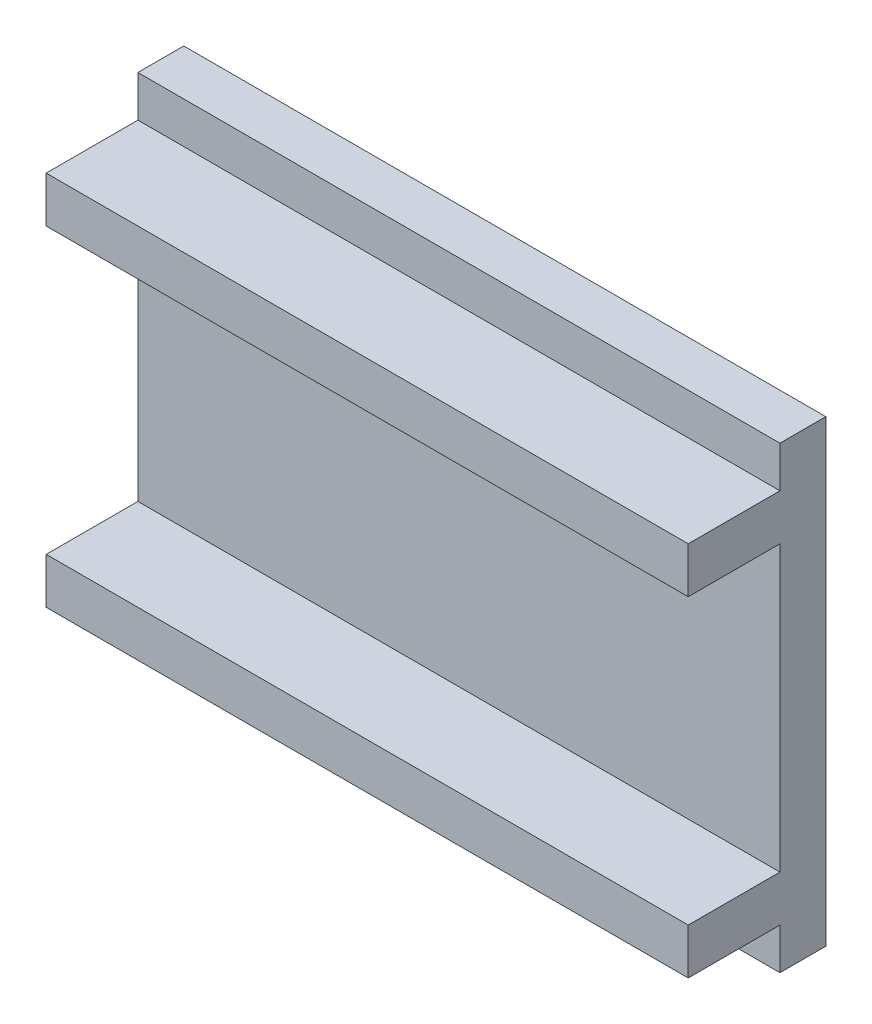
ISO-10303-21;
HEADER;
FILE_DESCRIPTION(('STEP AP214'),'2;1');
FILE_NAME('part.step','',(''),(''),'','','');
FILE_SCHEMA(('AUTOMOTIVE_DESIGN { 1 0 10303 214 1 1 1 1 }'));
ENDSEC;
DATA;
#1=APPLICATION_CONTEXT('core data for automotive mechanical design processes');
#2=APPLICATION_PROTOCOL_DEFINITION('international standard','automotive_design',2000,#1);
#3=PRODUCT_CONTEXT('',#1,'mechanical');
#4=PRODUCT('Part','Part','',(#3));
#5=PRODUCT_RELATED_PRODUCT_CATEGORY('part','',(#4));
#6=PRODUCT_DEFINITION_FORMATION('','',#4);
#7=PRODUCT_DEFINITION_CONTEXT('part definition',#1,'design');
#8=PRODUCT_DEFINITION('design','',#6,#7);
#9=PRODUCT_DEFINITION_SHAPE('','',#8);
#10=(LENGTH_UNIT() NAMED_UNIT(*) SI_UNIT(.MILLI.,.METRE.));
#11=(NAMED_UNIT(*) PLANE_ANGLE_UNIT() SI_UNIT($,.RADIAN.));
#12=(NAMED_UNIT(*) SI_UNIT($,.STERADIAN.) SOLID_ANGLE_UNIT());
#13=UNCERTAINTY_MEASURE_WITH_UNIT(LENGTH_MEASURE(1.E-05),#10,'distance_accuracy_value','');
#14=(GEOMETRIC_REPRESENTATION_CONTEXT(3) GLOBAL_UNCERTAINTY_ASSIGNED_CONTEXT((#13)) GLOBAL_UNIT_ASSIGNED_CONTEXT((#10,
#11,#12)) REPRESENTATION_CONTEXT('',''));
#15=CARTESIAN_POINT('',(0.,0.,0.));
#16=DIRECTION('',(0.,0.,1.));
#17=DIRECTION('',(1.,0.,0.));
#18=AXIS2_PLACEMENT_3D('',#15,#16,#17);
#19=CARTESIAN_POINT('',(0.,0.,5.));
#20=DIRECTION('',(0.,0.,-1.));
#21=DIRECTION('',(-1.,0.,0.));
#22=AXIS2_PLACEMENT_3D('',#19,#20,#21);
#23=PLANE('',#22);
#24=DIRECTION('',(0.,1.,0.));
#25=VECTOR('',#24,1.);
#26=CARTESIAN_POINT('',(35.,-25.,5.));
#27=LINE('',#26,#25);
#28=CARTESIAN_POINT('',(35.,-25.,5.));
#29=VERTEX_POINT('',#28);
#30=CARTESIAN_POINT('',(35.,-20.5,5.));
#31=VERTEX_POINT('',#30);
#32=EDGE_CURVE('E69',#29,#31,#27,.T.);
#33=ORIENTED_EDGE('',*,*,#32,.T.);
#34=DIRECTION('',(-1.,0.,0.));
#35=VECTOR('',#34,1.);
#36=CARTESIAN_POINT('',(-35.,-20.5,5.));
#37=LINE('',#36,#35);
#38=CARTESIAN_POINT('',(-35.,-20.5,5.));
#39=VERTEX_POINT('',#38);
#40=EDGE_CURVE('E171',#31,#39,#37,.T.);
#41=ORIENTED_EDGE('',*,*,#40,.T.);
#42=DIRECTION('',(0.,-1.,0.));
#43=VECTOR('',#42,1.);
#44=CARTESIAN_POINT('',(-35.,-25.,5.));
#45=LINE('',#44,#43);
#46=CARTESIAN_POINT('',(-35.,-25.,5.));
#47=VERTEX_POINT('',#46);
#48=EDGE_CURVE('E143',#39,#47,#45,.T.);
#49=ORIENTED_EDGE('',*,*,#48,.T.);
#50=DIRECTION('',(1.,0.,0.));
#51=VECTOR('',#50,1.);
#52=CARTESIAN_POINT('',(-35.,-25.,5.));
#53=LINE('',#52,#51);
#54=EDGE_CURVE('E231',#47,#29,#53,.T.);
#55=ORIENTED_EDGE('',*,*,#54,.T.);
#56=EDGE_LOOP('',(#33,#41,#49,#55));
#57=FACE_BOUND('',#56,.T.);
#58=ADVANCED_FACE('F45',(#57),#23,.F.);
#59=DIRECTION('',(-1.,0.,0.));
#60=VECTOR('',#59,1.);
#61=CARTESIAN_POINT('',(-35.,20.5,5.));
#62=LINE('',#61,#60);
#63=CARTESIAN_POINT('',(35.,20.5,5.));
#64=VERTEX_POINT('',#63);
#65=CARTESIAN_POINT('',(-35.,20.5,5.));
#66=VERTEX_POINT('',#65);
#67=EDGE_CURVE('E189',#64,#66,#62,.T.);
#68=ORIENTED_EDGE('',*,*,#67,.F.);
#69=CARTESIAN_POINT('',(35.,25.,5.));
#70=VERTEX_POINT('',#69);
#71=EDGE_CURVE('E225',#64,#70,#27,.T.);
#72=ORIENTED_EDGE('',*,*,#71,.T.);
#73=DIRECTION('',(-1.,0.,0.));
#74=VECTOR('',#73,1.);
#75=CARTESIAN_POINT('',(-35.,25.,5.));
#76=LINE('',#75,#74);
#77=CARTESIAN_POINT('',(-35.,25.,5.));
#78=VERTEX_POINT('',#77);
#79=EDGE_CURVE('E223',#70,#78,#76,.T.);
#80=ORIENTED_EDGE('',*,*,#79,.T.);
#81=EDGE_CURVE('E228',#78,#66,#45,.T.);
#82=ORIENTED_EDGE('',*,*,#81,.T.);
#83=EDGE_LOOP('',(#68,#72,#80,#82));
#84=FACE_BOUND('',#83,.T.);
#85=ADVANCED_FACE('F284',(#84),#23,.F.);
#86=CARTESIAN_POINT('',(-35.,15.5,5.));
#87=VERTEX_POINT('',#86);
#88=CARTESIAN_POINT('',(-35.,-15.5,5.));
#89=VERTEX_POINT('',#88);
#90=EDGE_CURVE('E232',#87,#89,#45,.T.);
#91=ORIENTED_EDGE('',*,*,#90,.T.);
#92=DIRECTION('',(1.,0.,0.));
#93=VECTOR('',#92,1.);
#94=CARTESIAN_POINT('',(-35.,-15.5,5.));
#95=LINE('',#94,#93);
#96=CARTESIAN_POINT('',(35.,-15.5,5.));
#97=VERTEX_POINT('',#96);
#98=EDGE_CURVE('E61',#89,#97,#95,.T.);
#99=ORIENTED_EDGE('',*,*,#98,.T.);
#100=CARTESIAN_POINT('',(35.,15.5,5.));
#101=VERTEX_POINT('',#100);
#102=EDGE_CURVE('E224',#97,#101,#27,.T.);
#103=ORIENTED_EDGE('',*,*,#102,.T.);
#104=DIRECTION('',(1.,0.,0.));
#105=VECTOR('',#104,1.);
#106=CARTESIAN_POINT('',(-35.,15.5,5.));
#107=LINE('',#106,#105);
#108=EDGE_CURVE('E148',#87,#101,#107,.T.);
#109=ORIENTED_EDGE('',*,*,#108,.F.);
#110=EDGE_LOOP('',(#91,#99,#103,#109));
#111=FACE_BOUND('',#110,.T.);
#112=ADVANCED_FACE('F274',(#111),#23,.F.);
#113=CARTESIAN_POINT('',(35.,-25.,5.));
#114=DIRECTION('',(-1.,0.,0.));
#115=DIRECTION('',(0.,0.,1.));
#116=AXIS2_PLACEMENT_3D('',#113,#114,#115);
#117=PLANE('',#116);
#118=DIRECTION('',(0.,1.,0.));
#119=VECTOR('',#118,1.);
#120=CARTESIAN_POINT('',(35.,-25.,0.));
#121=LINE('',#120,#119);
#122=CARTESIAN_POINT('',(35.,-25.,0.));
#123=VERTEX_POINT('',#122);
#124=CARTESIAN_POINT('',(35.,25.,0.));
#125=VERTEX_POINT('',#124);
#126=EDGE_CURVE('E220',#123,#125,#121,.T.);
#127=ORIENTED_EDGE('',*,*,#126,.T.);
#128=DIRECTION('',(0.,0.,-1.));
#129=VECTOR('',#128,1.);
#130=CARTESIAN_POINT('',(35.,25.,5.));
#131=LINE('',#130,#129);
#132=EDGE_CURVE('E11',#70,#125,#131,.T.);
#133=ORIENTED_EDGE('',*,*,#132,.F.);
#134=ORIENTED_EDGE('',*,*,#71,.F.);
#135=DIRECTION('',(0.,0.,-1.));
#136=VECTOR('',#135,1.);
#137=CARTESIAN_POINT('',(35.,20.5,15.));
#138=LINE('',#137,#136);
#139=CARTESIAN_POINT('',(35.,20.5,15.));
#140=VERTEX_POINT('',#139);
#141=EDGE_CURVE('E208',#140,#64,#138,.T.);
#142=ORIENTED_EDGE('',*,*,#141,.F.);
#143=DIRECTION('',(0.,1.,0.));
#144=VECTOR('',#143,1.);
#145=CARTESIAN_POINT('',(35.,20.5,15.));
#146=LINE('',#145,#144);
#147=CARTESIAN_POINT('',(35.,15.5,15.));
#148=VERTEX_POINT('',#147);
#149=EDGE_CURVE('E192',#148,#140,#146,.T.);
#150=ORIENTED_EDGE('',*,*,#149,.F.);
#151=DIRECTION('',(0.,0.,-1.));
#152=VECTOR('',#151,1.);
#153=CARTESIAN_POINT('',(35.,15.5,15.));
#154=LINE('',#153,#152);
#155=EDGE_CURVE('E212',#148,#101,#154,.T.);
#156=ORIENTED_EDGE('',*,*,#155,.T.);
#157=ORIENTED_EDGE('',*,*,#102,.F.);
#158=DIRECTION('',(0.,0.,-1.));
#159=VECTOR('',#158,1.);
#160=CARTESIAN_POINT('',(35.,-15.5,15.));
#161=LINE('',#160,#159);
#162=CARTESIAN_POINT('',(35.,-15.5,15.));
#163=VERTEX_POINT('',#162);
#164=EDGE_CURVE('E178',#163,#97,#161,.T.);
#165=ORIENTED_EDGE('',*,*,#164,.F.);
#166=DIRECTION('',(0.,-1.,0.));
#167=VECTOR('',#166,1.);
#168=CARTESIAN_POINT('',(35.,-20.5,15.));
#169=LINE('',#168,#167);
#170=CARTESIAN_POINT('',(35.,-20.5,15.));
#171=VERTEX_POINT('',#170);
#172=EDGE_CURVE('E163',#163,#171,#169,.T.);
#173=ORIENTED_EDGE('',*,*,#172,.T.);
#174=DIRECTION('',(0.,0.,-1.));
#175=VECTOR('',#174,1.);
#176=CARTESIAN_POINT('',(35.,-20.5,15.));
#177=LINE('',#176,#175);
#178=EDGE_CURVE('E149',#171,#31,#177,.T.);
#179=ORIENTED_EDGE('',*,*,#178,.T.);
#180=ORIENTED_EDGE('',*,*,#32,.F.);
#181=DIRECTION('',(0.,0.,-1.));
#182=VECTOR('',#181,1.);
#183=CARTESIAN_POINT('',(35.,-25.,5.));
#184=LINE('',#183,#182);
#185=EDGE_CURVE('E235',#29,#123,#184,.T.);
#186=ORIENTED_EDGE('',*,*,#185,.T.);
#187=EDGE_LOOP('',(#127,#133,#134,#142,#150,#156,#157,#165,#173,#179,#180,#186));
#188=FACE_BOUND('',#187,.T.);
#189=ADVANCED_FACE('F47',(#188),#117,.F.);
#190=CARTESIAN_POINT('',(-35.,25.,5.));
#191=DIRECTION('',(0.,-1.,0.));
#192=DIRECTION('',(0.,0.,-1.));
#193=AXIS2_PLACEMENT_3D('',#190,#191,#192);
#194=PLANE('',#193);
#195=DIRECTION('',(-1.,0.,0.));
#196=VECTOR('',#195,1.);
#197=CARTESIAN_POINT('',(-35.,25.,0.));
#198=LINE('',#197,#196);
#199=CARTESIAN_POINT('',(-35.,25.,0.));
#200=VERTEX_POINT('',#199);
#201=EDGE_CURVE('E239',#125,#200,#198,.T.);
#202=ORIENTED_EDGE('',*,*,#201,.T.);
#203=DIRECTION('',(0.,0.,-1.));
#204=VECTOR('',#203,1.);
#205=CARTESIAN_POINT('',(-35.,25.,5.));
#206=LINE('',#205,#204);
#207=EDGE_CURVE('E54',#78,#200,#206,.T.);
#208=ORIENTED_EDGE('',*,*,#207,.F.);
#209=ORIENTED_EDGE('',*,*,#79,.F.);
#210=ORIENTED_EDGE('',*,*,#132,.T.);
#211=EDGE_LOOP('',(#202,#208,#209,#210));
#212=FACE_BOUND('',#211,.T.);
#213=ADVANCED_FACE('F286',(#212),#194,.F.);
#214=CARTESIAN_POINT('',(-35.,-25.,5.));
#215=DIRECTION('',(1.,0.,0.));
#216=DIRECTION('',(0.,0.,-1.));
#217=AXIS2_PLACEMENT_3D('',#214,#215,#216);
#218=PLANE('',#217);
#219=DIRECTION('',(0.,-1.,0.));
#220=VECTOR('',#219,1.);
#221=CARTESIAN_POINT('',(-35.,-25.,0.));
#222=LINE('',#221,#220);
#223=CARTESIAN_POINT('',(-35.,-25.,0.));
#224=VERTEX_POINT('',#223);
#225=EDGE_CURVE('E242',#200,#224,#222,.T.);
#226=ORIENTED_EDGE('',*,*,#225,.T.);
#227=DIRECTION('',(0.,0.,-1.));
#228=VECTOR('',#227,1.);
#229=CARTESIAN_POINT('',(-35.,-25.,5.));
#230=LINE('',#229,#228);
#231=EDGE_CURVE('E251',#47,#224,#230,.T.);
#232=ORIENTED_EDGE('',*,*,#231,.F.);
#233=ORIENTED_EDGE('',*,*,#48,.F.);
#234=DIRECTION('',(0.,0.,-1.));
#235=VECTOR('',#234,1.);
#236=CARTESIAN_POINT('',(-35.,-20.5,15.));
#237=LINE('',#236,#235);
#238=CARTESIAN_POINT('',(-35.,-20.5,15.));
#239=VERTEX_POINT('',#238);
#240=EDGE_CURVE('E136',#239,#39,#237,.T.);
#241=ORIENTED_EDGE('',*,*,#240,.F.);
#242=DIRECTION('',(0.,1.,0.));
#243=VECTOR('',#242,1.);
#244=CARTESIAN_POINT('',(-35.,-20.5,15.));
#245=LINE('',#244,#243);
#246=CARTESIAN_POINT('',(-35.,-15.5,15.));
#247=VERTEX_POINT('',#246);
#248=EDGE_CURVE('E140',#239,#247,#245,.T.);
#249=ORIENTED_EDGE('',*,*,#248,.T.);
#250=DIRECTION('',(0.,0.,-1.));
#251=VECTOR('',#250,1.);
#252=CARTESIAN_POINT('',(-35.,-15.5,15.));
#253=LINE('',#252,#251);
#254=EDGE_CURVE('E170',#247,#89,#253,.T.);
#255=ORIENTED_EDGE('',*,*,#254,.T.);
#256=ORIENTED_EDGE('',*,*,#90,.F.);
#257=DIRECTION('',(0.,0.,-1.));
#258=VECTOR('',#257,1.);
#259=CARTESIAN_POINT('',(-35.,15.5,15.));
#260=LINE('',#259,#258);
#261=CARTESIAN_POINT('',(-35.,15.5,15.));
#262=VERTEX_POINT('',#261);
#263=EDGE_CURVE('E216',#262,#87,#260,.T.);
#264=ORIENTED_EDGE('',*,*,#263,.F.);
#265=DIRECTION('',(0.,-1.,0.));
#266=VECTOR('',#265,1.);
#267=CARTESIAN_POINT('',(-35.,20.5,15.));
#268=LINE('',#267,#266);
#269=CARTESIAN_POINT('',(-35.,20.5,15.));
#270=VERTEX_POINT('',#269);
#271=EDGE_CURVE('E184',#270,#262,#268,.T.);
#272=ORIENTED_EDGE('',*,*,#271,.F.);
#273=DIRECTION('',(0.,0.,-1.));
#274=VECTOR('',#273,1.);
#275=CARTESIAN_POINT('',(-35.,20.5,15.));
#276=LINE('',#275,#274);
#277=EDGE_CURVE('E198',#270,#66,#276,.T.);
#278=ORIENTED_EDGE('',*,*,#277,.T.);
#279=ORIENTED_EDGE('',*,*,#81,.F.);
#280=ORIENTED_EDGE('',*,*,#207,.T.);
#281=EDGE_LOOP('',(#226,#232,#233,#241,#249,#255,#256,#264,#272,#278,#279,#280));
#282=FACE_BOUND('',#281,.T.);
#283=ADVANCED_FACE('F138',(#282),#218,.F.);
#284=CARTESIAN_POINT('',(-35.,-25.,5.));
#285=DIRECTION('',(0.,1.,0.));
#286=DIRECTION('',(0.,0.,1.));
#287=AXIS2_PLACEMENT_3D('',#284,#285,#286);
#288=PLANE('',#287);
#289=DIRECTION('',(1.,0.,0.));
#290=VECTOR('',#289,1.);
#291=CARTESIAN_POINT('',(-35.,-25.,0.));
#292=LINE('',#291,#290);
#293=EDGE_CURVE('E245',#224,#123,#292,.T.);
#294=ORIENTED_EDGE('',*,*,#293,.T.);
#295=ORIENTED_EDGE('',*,*,#185,.F.);
#296=ORIENTED_EDGE('',*,*,#54,.F.);
#297=ORIENTED_EDGE('',*,*,#231,.T.);
#298=EDGE_LOOP('',(#294,#295,#296,#297));
#299=FACE_BOUND('',#298,.T.);
#300=ADVANCED_FACE('F267',(#299),#288,.F.);
#301=CARTESIAN_POINT('',(0.,0.,0.));
#302=DIRECTION('',(0.,0.,-1.));
#303=DIRECTION('',(-1.,0.,0.));
#304=AXIS2_PLACEMENT_3D('',#301,#302,#303);
#305=PLANE('',#304);
#306=ORIENTED_EDGE('',*,*,#126,.F.);
#307=ORIENTED_EDGE('',*,*,#293,.F.);
#308=ORIENTED_EDGE('',*,*,#225,.F.);
#309=ORIENTED_EDGE('',*,*,#201,.F.);
#310=EDGE_LOOP('',(#306,#307,#308,#309));
#311=FACE_BOUND('',#310,.T.);
#312=ADVANCED_FACE('F264',(#311),#305,.T.);
#313=CARTESIAN_POINT('',(-35.,15.5,15.));
#314=DIRECTION('',(0.,1.,0.));
#315=DIRECTION('',(0.,0.,1.));
#316=AXIS2_PLACEMENT_3D('',#313,#314,#315);
#317=PLANE('',#316);
#318=ORIENTED_EDGE('',*,*,#108,.T.);
#319=ORIENTED_EDGE('',*,*,#155,.F.);
#320=DIRECTION('',(1.,0.,0.));
#321=VECTOR('',#320,1.);
#322=CARTESIAN_POINT('',(-35.,15.5,15.));
#323=LINE('',#322,#321);
#324=EDGE_CURVE('E188',#262,#148,#323,.T.);
#325=ORIENTED_EDGE('',*,*,#324,.F.);
#326=ORIENTED_EDGE('',*,*,#263,.T.);
#327=EDGE_LOOP('',(#318,#319,#325,#326));
#328=FACE_BOUND('',#327,.T.);
#329=ADVANCED_FACE('F361',(#328),#317,.F.);
#330=CARTESIAN_POINT('',(-35.,20.5,15.));
#331=DIRECTION('',(0.,-1.,0.));
#332=DIRECTION('',(0.,0.,-1.));
#333=AXIS2_PLACEMENT_3D('',#330,#331,#332);
#334=PLANE('',#333);
#335=ORIENTED_EDGE('',*,*,#67,.T.);
#336=ORIENTED_EDGE('',*,*,#277,.F.);
#337=DIRECTION('',(-1.,0.,0.));
#338=VECTOR('',#337,1.);
#339=CARTESIAN_POINT('',(-35.,20.5,15.));
#340=LINE('',#339,#338);
#341=EDGE_CURVE('E195',#140,#270,#340,.T.);
#342=ORIENTED_EDGE('',*,*,#341,.F.);
#343=ORIENTED_EDGE('',*,*,#141,.T.);
#344=EDGE_LOOP('',(#335,#336,#342,#343));
#345=FACE_BOUND('',#344,.T.);
#346=ADVANCED_FACE('F352',(#345),#334,.F.);
#347=CARTESIAN_POINT('',(0.,0.,15.));
#348=DIRECTION('',(0.,0.,1.));
#349=DIRECTION('',(1.,0.,0.));
#350=AXIS2_PLACEMENT_3D('',#347,#348,#349);
#351=PLANE('',#350);
#352=ORIENTED_EDGE('',*,*,#271,.T.);
#353=ORIENTED_EDGE('',*,*,#324,.T.);
#354=ORIENTED_EDGE('',*,*,#149,.T.);
#355=ORIENTED_EDGE('',*,*,#341,.T.);
#356=EDGE_LOOP('',(#352,#353,#354,#355));
#357=FACE_BOUND('',#356,.T.);
#358=ADVANCED_FACE('F323',(#357),#351,.T.);
#359=CARTESIAN_POINT('',(-35.,-20.5,15.));
#360=DIRECTION('',(0.,-1.,0.));
#361=DIRECTION('',(0.,0.,-1.));
#362=AXIS2_PLACEMENT_3D('',#359,#360,#361);
#363=PLANE('',#362);
#364=ORIENTED_EDGE('',*,*,#40,.F.);
#365=ORIENTED_EDGE('',*,*,#178,.F.);
#366=DIRECTION('',(-1.,0.,0.));
#367=VECTOR('',#366,1.);
#368=CARTESIAN_POINT('',(-35.,-20.5,15.));
#369=LINE('',#368,#367);
#370=EDGE_CURVE('E155',#171,#239,#369,.T.);
#371=ORIENTED_EDGE('',*,*,#370,.T.);
#372=ORIENTED_EDGE('',*,*,#240,.T.);
#373=EDGE_LOOP('',(#364,#365,#371,#372));
#374=FACE_BOUND('',#373,.T.);
#375=ADVANCED_FACE('F161',(#374),#363,.T.);
#376=CARTESIAN_POINT('',(-35.,-15.5,15.));
#377=DIRECTION('',(0.,1.,0.));
#378=DIRECTION('',(0.,0.,1.));
#379=AXIS2_PLACEMENT_3D('',#376,#377,#378);
#380=PLANE('',#379);
#381=ORIENTED_EDGE('',*,*,#98,.F.);
#382=ORIENTED_EDGE('',*,*,#254,.F.);
#383=DIRECTION('',(1.,0.,0.));
#384=VECTOR('',#383,1.);
#385=CARTESIAN_POINT('',(-35.,-15.5,15.));
#386=LINE('',#385,#384);
#387=EDGE_CURVE('E158',#247,#163,#386,.T.);
#388=ORIENTED_EDGE('',*,*,#387,.T.);
#389=ORIENTED_EDGE('',*,*,#164,.T.);
#390=EDGE_LOOP('',(#381,#382,#388,#389));
#391=FACE_BOUND('',#390,.T.);
#392=ADVANCED_FACE('F277',(#391),#380,.T.);
#393=CARTESIAN_POINT('',(0.,0.,15.));
#394=DIRECTION('',(0.,0.,1.));
#395=DIRECTION('',(1.,0.,0.));
#396=AXIS2_PLACEMENT_3D('',#393,#394,#395);
#397=PLANE('',#396);
#398=ORIENTED_EDGE('',*,*,#248,.F.);
#399=ORIENTED_EDGE('',*,*,#370,.F.);
#400=ORIENTED_EDGE('',*,*,#172,.F.);
#401=ORIENTED_EDGE('',*,*,#387,.F.);
#402=EDGE_LOOP('',(#398,#399,#400,#401));
#403=FACE_BOUND('',#402,.T.);
#404=ADVANCED_FACE('F153',(#403),#397,.T.);
#405=CLOSED_SHELL('',(#58,#85,#112,#189,#213,#283,#300,#312,#329,#346,#358,#375,#392,#404));
#406=MANIFOLD_SOLID_BREP('B2',#405);
#407=ADVANCED_BREP_SHAPE_REPRESENTATION('',(#18,#406),#14);
#408=SHAPE_DEFINITION_REPRESENTATION(#9,#407);
ENDSEC;
END-ISO-10303-21;
